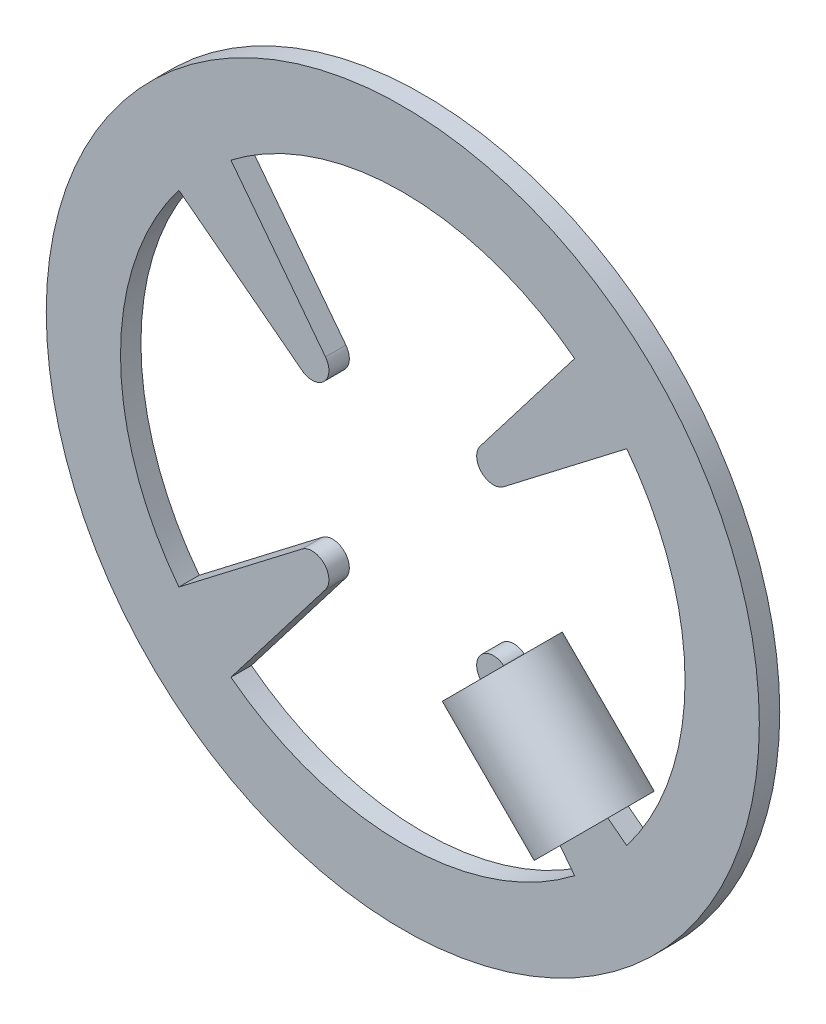
ISO-10303-21;
HEADER;
FILE_DESCRIPTION(('STEP AP214'),'2;1');
FILE_NAME('part.step','',(''),(''),'','','');
FILE_SCHEMA(('AUTOMOTIVE_DESIGN { 1 0 10303 214 1 1 1 1 }'));
ENDSEC;
DATA;
#1=APPLICATION_CONTEXT('core data for automotive mechanical design processes');
#2=APPLICATION_PROTOCOL_DEFINITION('international standard','automotive_design',2000,#1);
#3=PRODUCT_CONTEXT('',#1,'mechanical');
#4=PRODUCT('Part','Part','',(#3));
#5=PRODUCT_RELATED_PRODUCT_CATEGORY('part','',(#4));
#6=PRODUCT_DEFINITION_FORMATION('','',#4);
#7=PRODUCT_DEFINITION_CONTEXT('part definition',#1,'design');
#8=PRODUCT_DEFINITION('design','',#6,#7);
#9=PRODUCT_DEFINITION_SHAPE('','',#8);
#10=(LENGTH_UNIT() NAMED_UNIT(*) SI_UNIT(.MILLI.,.METRE.));
#11=(NAMED_UNIT(*) PLANE_ANGLE_UNIT() SI_UNIT($,.RADIAN.));
#12=(NAMED_UNIT(*) SI_UNIT($,.STERADIAN.) SOLID_ANGLE_UNIT());
#13=UNCERTAINTY_MEASURE_WITH_UNIT(LENGTH_MEASURE(1.E-05),#10,'distance_accuracy_value','');
#14=(GEOMETRIC_REPRESENTATION_CONTEXT(3) GLOBAL_UNCERTAINTY_ASSIGNED_CONTEXT((#13)) GLOBAL_UNIT_ASSIGNED_CONTEXT((#10,
#11,#12)) REPRESENTATION_CONTEXT('',''));
#15=CARTESIAN_POINT('',(0.,0.,0.));
#16=DIRECTION('',(0.,0.,1.));
#17=DIRECTION('',(1.,0.,0.));
#18=AXIS2_PLACEMENT_3D('',#15,#16,#17);
#19=CARTESIAN_POINT('',(0.487903679018716,-0.487903679018716,0.0275));
#20=DIRECTION('',(0.707106781186547,-0.707106781186548,0.));
#21=DIRECTION('',(0.707106781186548,0.707106781186547,0.));
#22=AXIS2_PLACEMENT_3D('',#19,#20,#21);
#23=PLANE('',#22);
#24=CARTESIAN_POINT('',(0.487903679018716,-0.487903679018716,0.0275));
#25=DIRECTION('',(0.707106781186547,-0.707106781186548,0.));
#26=DIRECTION('',(0.707106781186548,0.707106781186547,0.));
#27=AXIS2_PLACEMENT_3D('',#24,#25,#26);
#28=CIRCLE('',#27,0.132);
#29=CARTESIAN_POINT('',(0.58124177413534,-0.394565583902092,0.0275));
#30=VERTEX_POINT('',#29);
#31=EDGE_CURVE('E11',#30,#30,#28,.T.);
#32=ORIENTED_EDGE('',*,*,#31,.T.);
#33=EDGE_LOOP('',(#32));
#34=FACE_BOUND('',#33,.T.);
#35=CARTESIAN_POINT('',(0.487903679018716,-0.487903679018716,0.0275));
#36=DIRECTION('',(0.707106781186547,-0.707106781186548,0.));
#37=DIRECTION('',(0.707106781186548,0.707106781186547,0.));
#38=AXIS2_PLACEMENT_3D('',#35,#36,#37);
#39=CIRCLE('',#38,0.1);
#40=CARTESIAN_POINT('',(0.558614357137371,-0.417193000900062,0.0275));
#41=VERTEX_POINT('',#40);
#42=EDGE_CURVE('E60',#41,#41,#39,.T.);
#43=ORIENTED_EDGE('',*,*,#42,.F.);
#44=EDGE_LOOP('',(#43));
#45=FACE_BOUND('',#44,.T.);
#46=ADVANCED_FACE('F49',(#34,#45),#23,.T.);
#47=CARTESIAN_POINT('',(0.240416305603425,-0.240416305603425,0.0275));
#48=DIRECTION('',(0.707106781186547,-0.707106781186548,0.));
#49=DIRECTION('',(0.707106781186548,0.707106781186547,0.));
#50=AXIS2_PLACEMENT_3D('',#47,#48,#49);
#51=PLANE('',#50);
#52=CARTESIAN_POINT('',(0.240416305603425,-0.240416305603425,0.0275));
#53=DIRECTION('',(0.707106781186547,-0.707106781186548,0.));
#54=DIRECTION('',(0.707106781186548,0.707106781186547,0.));
#55=AXIS2_PLACEMENT_3D('',#52,#53,#54);
#56=CIRCLE('',#55,0.132);
#57=CARTESIAN_POINT('',(0.333754400720049,-0.1470782104868,0.0275));
#58=VERTEX_POINT('',#57);
#59=EDGE_CURVE('E53',#58,#58,#56,.T.);
#60=ORIENTED_EDGE('',*,*,#59,.F.);
#61=EDGE_LOOP('',(#60));
#62=FACE_BOUND('',#61,.T.);
#63=CARTESIAN_POINT('',(0.240416305603425,-0.240416305603425,0.0275));
#64=DIRECTION('',(0.707106781186547,-0.707106781186548,0.));
#65=DIRECTION('',(0.707106781186548,0.707106781186547,0.));
#66=AXIS2_PLACEMENT_3D('',#63,#64,#65);
#67=CIRCLE('',#66,0.1);
#68=CARTESIAN_POINT('',(0.311126983722079,-0.16970562748477,0.0275));
#69=VERTEX_POINT('',#68);
#70=EDGE_CURVE('E62',#69,#69,#67,.T.);
#71=ORIENTED_EDGE('',*,*,#70,.T.);
#72=EDGE_LOOP('',(#71));
#73=FACE_BOUND('',#72,.T.);
#74=ADVANCED_FACE('F72',(#62,#73),#51,.F.);
#75=CARTESIAN_POINT('',(0.487903679018716,-0.487903679018716,0.0275));
#76=DIRECTION('',(-0.707106781186547,0.707106781186548,0.));
#77=DIRECTION('',(-0.707106781186548,-0.707106781186547,0.));
#78=AXIS2_PLACEMENT_3D('',#75,#76,#77);
#79=CYLINDRICAL_SURFACE('',#78,0.132);
#80=ORIENTED_EDGE('',*,*,#31,.F.);
#81=EDGE_LOOP('',(#80));
#82=FACE_BOUND('',#81,.T.);
#83=ORIENTED_EDGE('',*,*,#59,.T.);
#84=EDGE_LOOP('',(#83));
#85=FACE_BOUND('',#84,.T.);
#86=ADVANCED_FACE('F51',(#82,#85),#79,.T.);
#87=CARTESIAN_POINT('',(0.487903679018716,-0.487903679018716,0.0275));
#88=DIRECTION('',(-0.707106781186547,0.707106781186548,0.));
#89=DIRECTION('',(-0.707106781186548,-0.707106781186547,0.));
#90=AXIS2_PLACEMENT_3D('',#87,#88,#89);
#91=CYLINDRICAL_SURFACE('',#90,0.1);
#92=ORIENTED_EDGE('',*,*,#42,.T.);
#93=EDGE_LOOP('',(#92));
#94=FACE_BOUND('',#93,.T.);
#95=ORIENTED_EDGE('',*,*,#70,.F.);
#96=EDGE_LOOP('',(#95));
#97=FACE_BOUND('',#96,.T.);
#98=ADVANCED_FACE('F68',(#94,#97),#91,.F.);
#99=CLOSED_SHELL('',(#46,#74,#86,#98));
#100=MANIFOLD_SOLID_BREP('B2',#99);
#101=CARTESIAN_POINT('',(0.,0.,0.055));
#102=DIRECTION('',(0.,0.,-1.));
#103=DIRECTION('',(-1.,0.,0.));
#104=AXIS2_PLACEMENT_3D('',#101,#102,#103);
#105=CYLINDRICAL_SURFACE('',#104,0.76);
#106=CARTESIAN_POINT('',(0.,0.,0.));
#107=DIRECTION('',(0.,0.,1.));
#108=DIRECTION('',(1.,0.,0.));
#109=AXIS2_PLACEMENT_3D('',#106,#107,#108);
#110=CIRCLE('',#109,0.76);
#111=CARTESIAN_POINT('',(-0.462658686046631,-0.602948538621336,0.));
#112=VERTEX_POINT('',#111);
#113=CARTESIAN_POINT('',(0.462658686046628,-0.602948538621339,0.));
#114=VERTEX_POINT('',#113);
#115=EDGE_CURVE('E352',#112,#114,#110,.T.);
#116=ORIENTED_EDGE('',*,*,#115,.F.);
#117=DIRECTION('',(0.,0.,1.));
#118=VECTOR('',#117,1.);
#119=CARTESIAN_POINT('',(-0.462658686046631,-0.602948538621336,0.));
#120=LINE('',#119,#118);
#121=CARTESIAN_POINT('',(-0.462658686046631,-0.602948538621336,0.055));
#122=VERTEX_POINT('',#121);
#123=EDGE_CURVE('E134',#112,#122,#120,.T.);
#124=ORIENTED_EDGE('',*,*,#123,.T.);
#125=CARTESIAN_POINT('',(0.,0.,0.055));
#126=DIRECTION('',(0.,0.,1.));
#127=DIRECTION('',(1.,0.,0.));
#128=AXIS2_PLACEMENT_3D('',#125,#126,#127);
#129=CIRCLE('',#128,0.76);
#130=CARTESIAN_POINT('',(0.462658686046628,-0.602948538621339,0.055));
#131=VERTEX_POINT('',#130);
#132=EDGE_CURVE('E350',#122,#131,#129,.T.);
#133=ORIENTED_EDGE('',*,*,#132,.T.);
#134=DIRECTION('',(0.,0.,1.));
#135=VECTOR('',#134,1.);
#136=CARTESIAN_POINT('',(0.462658686046628,-0.602948538621339,0.));
#137=LINE('',#136,#135);
#138=EDGE_CURVE('E287',#114,#131,#137,.T.);
#139=ORIENTED_EDGE('',*,*,#138,.F.);
#140=EDGE_LOOP('',(#116,#124,#133,#139));
#141=FACE_BOUND('',#140,.T.);
#142=ADVANCED_FACE('F119',(#141),#105,.F.);
#143=CARTESIAN_POINT('',(0.602948538621336,-0.462658686046631,0.));
#144=VERTEX_POINT('',#143);
#145=CARTESIAN_POINT('',(0.602948538621339,0.462658686046628,0.));
#146=VERTEX_POINT('',#145);
#147=EDGE_CURVE('E354',#144,#146,#110,.T.);
#148=ORIENTED_EDGE('',*,*,#147,.F.);
#149=DIRECTION('',(0.,0.,1.));
#150=VECTOR('',#149,1.);
#151=CARTESIAN_POINT('',(0.602948538621336,-0.462658686046631,0.));
#152=LINE('',#151,#150);
#153=CARTESIAN_POINT('',(0.602948538621336,-0.462658686046631,0.055));
#154=VERTEX_POINT('',#153);
#155=EDGE_CURVE('E142',#144,#154,#152,.T.);
#156=ORIENTED_EDGE('',*,*,#155,.T.);
#157=CARTESIAN_POINT('',(0.602948538621339,0.462658686046628,0.055));
#158=VERTEX_POINT('',#157);
#159=EDGE_CURVE('E353',#154,#158,#129,.T.);
#160=ORIENTED_EDGE('',*,*,#159,.T.);
#161=DIRECTION('',(0.,0.,1.));
#162=VECTOR('',#161,1.);
#163=CARTESIAN_POINT('',(0.602948538621339,0.462658686046628,0.));
#164=LINE('',#163,#162);
#165=EDGE_CURVE('E314',#146,#158,#164,.T.);
#166=ORIENTED_EDGE('',*,*,#165,.F.);
#167=EDGE_LOOP('',(#148,#156,#160,#166));
#168=FACE_BOUND('',#167,.T.);
#169=ADVANCED_FACE('F367',(#168),#105,.F.);
#170=CARTESIAN_POINT('',(0.462658686046631,0.602948538621336,0.));
#171=VERTEX_POINT('',#170);
#172=CARTESIAN_POINT('',(-0.462658686046628,0.602948538621339,0.));
#173=VERTEX_POINT('',#172);
#174=EDGE_CURVE('E340',#171,#173,#110,.T.);
#175=ORIENTED_EDGE('',*,*,#174,.F.);
#176=DIRECTION('',(0.,0.,1.));
#177=VECTOR('',#176,1.);
#178=CARTESIAN_POINT('',(0.462658686046631,0.602948538621336,0.));
#179=LINE('',#178,#177);
#180=CARTESIAN_POINT('',(0.462658686046631,0.602948538621336,0.055));
#181=VERTEX_POINT('',#180);
#182=EDGE_CURVE('E310',#171,#181,#179,.T.);
#183=ORIENTED_EDGE('',*,*,#182,.T.);
#184=CARTESIAN_POINT('',(-0.462658686046628,0.602948538621339,0.055));
#185=VERTEX_POINT('',#184);
#186=EDGE_CURVE('E351',#181,#185,#129,.T.);
#187=ORIENTED_EDGE('',*,*,#186,.T.);
#188=DIRECTION('',(0.,0.,1.));
#189=VECTOR('',#188,1.);
#190=CARTESIAN_POINT('',(-0.462658686046628,0.602948538621339,0.));
#191=LINE('',#190,#189);
#192=EDGE_CURVE('E341',#173,#185,#191,.T.);
#193=ORIENTED_EDGE('',*,*,#192,.F.);
#194=EDGE_LOOP('',(#175,#183,#187,#193));
#195=FACE_BOUND('',#194,.T.);
#196=ADVANCED_FACE('F403',(#195),#105,.F.);
#197=DIRECTION('',(0.,0.,1.));
#198=VECTOR('',#197,1.);
#199=CARTESIAN_POINT('',(-0.602948538621339,-0.462658686046628,0.));
#200=LINE('',#199,#198);
#201=CARTESIAN_POINT('',(-0.602948538621339,-0.462658686046628,0.));
#202=VERTEX_POINT('',#201);
#203=CARTESIAN_POINT('',(-0.602948538621339,-0.462658686046628,0.055));
#204=VERTEX_POINT('',#203);
#205=EDGE_CURVE('E244',#202,#204,#200,.T.);
#206=ORIENTED_EDGE('',*,*,#205,.F.);
#207=CARTESIAN_POINT('',(-0.602948538621336,0.462658686046631,0.));
#208=VERTEX_POINT('',#207);
#209=EDGE_CURVE('E253',#208,#202,#110,.T.);
#210=ORIENTED_EDGE('',*,*,#209,.F.);
#211=DIRECTION('',(0.,0.,1.));
#212=VECTOR('',#211,1.);
#213=CARTESIAN_POINT('',(-0.602948538621336,0.462658686046631,0.));
#214=LINE('',#213,#212);
#215=CARTESIAN_POINT('',(-0.602948538621336,0.462658686046631,0.055));
#216=VERTEX_POINT('',#215);
#217=EDGE_CURVE('E337',#208,#216,#214,.T.);
#218=ORIENTED_EDGE('',*,*,#217,.T.);
#219=EDGE_CURVE('E347',#216,#204,#129,.T.);
#220=ORIENTED_EDGE('',*,*,#219,.T.);
#221=EDGE_LOOP('',(#206,#210,#218,#220));
#222=FACE_BOUND('',#221,.T.);
#223=ADVANCED_FACE('F387',(#222),#105,.F.);
#224=CARTESIAN_POINT('',(0.,0.,0.055));
#225=DIRECTION('',(0.,0.,1.));
#226=DIRECTION('',(1.,0.,0.));
#227=AXIS2_PLACEMENT_3D('',#224,#225,#226);
#228=PLANE('',#227);
#229=CARTESIAN_POINT('',(0.,0.,0.055));
#230=DIRECTION('',(0.,0.,1.));
#231=DIRECTION('',(1.,0.,0.));
#232=AXIS2_PLACEMENT_3D('',#229,#230,#231);
#233=CIRCLE('',#232,0.96);
#234=CARTESIAN_POINT('',(0.96,0.,0.055));
#235=VERTEX_POINT('',#234);
#236=EDGE_CURVE('E47',#235,#235,#233,.T.);
#237=ORIENTED_EDGE('',*,*,#236,.T.);
#238=EDGE_LOOP('',(#237));
#239=FACE_BOUND('',#238,.T.);
#240=ORIENTED_EDGE('',*,*,#219,.F.);
#241=DIRECTION('',(-0.793353340291235,0.60876142900872,0.));
#242=VECTOR('',#241,1.);
#243=CARTESIAN_POINT('',(0.,0.,0.055));
#244=LINE('',#243,#242);
#245=CARTESIAN_POINT('',(-0.271393831112811,0.208247810983869,0.055));
#246=VERTEX_POINT('',#245);
#247=EDGE_CURVE('E313',#246,#216,#244,.T.);
#248=ORIENTED_EDGE('',*,*,#247,.F.);
#249=CARTESIAN_POINT('',(-0.243977486679677,0.243977486679683,0.055));
#250=DIRECTION('',(0.,0.,1.));
#251=DIRECTION('',(1.,0.,0.));
#252=AXIS2_PLACEMENT_3D('',#249,#250,#251);
#253=CIRCLE('',#252,0.0450362705761065);
#254=CARTESIAN_POINT('',(-0.208247810983862,0.271393831112816,0.055));
#255=VERTEX_POINT('',#254);
#256=EDGE_CURVE('E332',#246,#255,#253,.T.);
#257=ORIENTED_EDGE('',*,*,#256,.T.);
#258=DIRECTION('',(-0.608761429008729,0.793353340291229,0.));
#259=VECTOR('',#258,1.);
#260=CARTESIAN_POINT('',(0.,0.,0.055));
#261=LINE('',#260,#259);
#262=EDGE_CURVE('E323',#255,#185,#261,.T.);
#263=ORIENTED_EDGE('',*,*,#262,.T.);
#264=ORIENTED_EDGE('',*,*,#186,.F.);
#265=DIRECTION('',(0.608761429008728,0.79335334029123,0.));
#266=VECTOR('',#265,1.);
#267=CARTESIAN_POINT('',(0.,0.,0.055));
#268=LINE('',#267,#266);
#269=CARTESIAN_POINT('',(0.208247810983866,0.271393831112813,0.055));
#270=VERTEX_POINT('',#269);
#271=EDGE_CURVE('E286',#270,#181,#268,.T.);
#272=ORIENTED_EDGE('',*,*,#271,.F.);
#273=CARTESIAN_POINT('',(0.24397748667968,0.243977486679679,0.055));
#274=DIRECTION('',(0.,0.,1.));
#275=DIRECTION('',(1.,0.,0.));
#276=AXIS2_PLACEMENT_3D('',#273,#274,#275);
#277=CIRCLE('',#276,0.0450362705761065);
#278=CARTESIAN_POINT('',(0.271393831112814,0.208247810983865,0.055));
#279=VERTEX_POINT('',#278);
#280=EDGE_CURVE('E305',#270,#279,#277,.T.);
#281=ORIENTED_EDGE('',*,*,#280,.T.);
#282=DIRECTION('',(0.793353340291234,0.608761429008722,0.));
#283=VECTOR('',#282,1.);
#284=CARTESIAN_POINT('',(0.,0.,0.055));
#285=LINE('',#284,#283);
#286=EDGE_CURVE('E297',#279,#158,#285,.T.);
#287=ORIENTED_EDGE('',*,*,#286,.T.);
#288=ORIENTED_EDGE('',*,*,#159,.F.);
#289=DIRECTION('',(0.793353340291232,-0.608761429008725,0.));
#290=VECTOR('',#289,1.);
#291=CARTESIAN_POINT('',(0.,0.,0.055));
#292=LINE('',#291,#290);
#293=CARTESIAN_POINT('',(0.271393831112813,-0.208247810983867,0.055));
#294=VERTEX_POINT('',#293);
#295=EDGE_CURVE('E266',#294,#154,#292,.T.);
#296=ORIENTED_EDGE('',*,*,#295,.F.);
#297=CARTESIAN_POINT('',(0.243977486679678,-0.243977486679681,0.055));
#298=DIRECTION('',(0.,0.,1.));
#299=DIRECTION('',(1.,0.,0.));
#300=AXIS2_PLACEMENT_3D('',#297,#298,#299);
#301=CIRCLE('',#300,0.0450362705761065);
#302=CARTESIAN_POINT('',(0.208247810983864,-0.271393831112815,0.055));
#303=VERTEX_POINT('',#302);
#304=EDGE_CURVE('E280',#294,#303,#301,.T.);
#305=ORIENTED_EDGE('',*,*,#304,.T.);
#306=DIRECTION('',(0.608761429008724,-0.793353340291233,0.));
#307=VECTOR('',#306,1.);
#308=CARTESIAN_POINT('',(0.,0.,0.055));
#309=LINE('',#308,#307);
#310=EDGE_CURVE('E272',#303,#131,#309,.T.);
#311=ORIENTED_EDGE('',*,*,#310,.T.);
#312=ORIENTED_EDGE('',*,*,#132,.F.);
#313=DIRECTION('',(-0.608761429008723,-0.793353340291233,0.));
#314=VECTOR('',#313,1.);
#315=CARTESIAN_POINT('',(0.,0.,0.055));
#316=LINE('',#315,#314);
#317=CARTESIAN_POINT('',(-0.208247810983868,-0.271393831112812,0.055));
#318=VERTEX_POINT('',#317);
#319=EDGE_CURVE('E257',#318,#122,#316,.T.);
#320=ORIENTED_EDGE('',*,*,#319,.F.);
#321=CARTESIAN_POINT('',(-0.243977486679682,-0.243977486679678,0.055));
#322=DIRECTION('',(0.,0.,1.));
#323=DIRECTION('',(1.,0.,0.));
#324=AXIS2_PLACEMENT_3D('',#321,#322,#323);
#325=CIRCLE('',#324,0.0450362705761065);
#326=CARTESIAN_POINT('',(-0.271393831112815,-0.208247810983863,0.055));
#327=VERTEX_POINT('',#326);
#328=EDGE_CURVE('E262',#318,#327,#325,.T.);
#329=ORIENTED_EDGE('',*,*,#328,.T.);
#330=DIRECTION('',(-0.793353340291231,-0.608761429008727,0.));
#331=VECTOR('',#330,1.);
#332=CARTESIAN_POINT('',(0.,0.,0.055));
#333=LINE('',#332,#331);
#334=EDGE_CURVE('E239',#327,#204,#333,.T.);
#335=ORIENTED_EDGE('',*,*,#334,.T.);
#336=EDGE_LOOP('',(#240,#248,#257,#263,#264,#272,#281,#287,#288,#296,#305,#311,#312,#320,#329,#335));
#337=FACE_BOUND('',#336,.T.);
#338=ADVANCED_FACE('F380',(#239,#337),#228,.T.);
#339=CARTESIAN_POINT('',(0.,0.,0.));
#340=DIRECTION('',(0.,0.,1.));
#341=DIRECTION('',(1.,0.,0.));
#342=AXIS2_PLACEMENT_3D('',#339,#340,#341);
#343=PLANE('',#342);
#344=CARTESIAN_POINT('',(0.,0.,0.));
#345=DIRECTION('',(0.,0.,1.));
#346=DIRECTION('',(1.,0.,0.));
#347=AXIS2_PLACEMENT_3D('',#344,#345,#346);
#348=CIRCLE('',#347,0.96);
#349=CARTESIAN_POINT('',(0.96,0.,0.));
#350=VERTEX_POINT('',#349);
#351=EDGE_CURVE('E123',#350,#350,#348,.T.);
#352=ORIENTED_EDGE('',*,*,#351,.F.);
#353=EDGE_LOOP('',(#352));
#354=FACE_BOUND('',#353,.T.);
#355=ORIENTED_EDGE('',*,*,#209,.T.);
#356=DIRECTION('',(-0.793353340291231,-0.608761429008727,0.));
#357=VECTOR('',#356,1.);
#358=CARTESIAN_POINT('',(0.,0.,0.));
#359=LINE('',#358,#357);
#360=CARTESIAN_POINT('',(-0.271393831112815,-0.208247810983863,0.));
#361=VERTEX_POINT('',#360);
#362=EDGE_CURVE('E236',#361,#202,#359,.T.);
#363=ORIENTED_EDGE('',*,*,#362,.F.);
#364=CARTESIAN_POINT('',(-0.243977486679682,-0.243977486679678,0.));
#365=DIRECTION('',(0.,0.,1.));
#366=DIRECTION('',(1.,0.,0.));
#367=AXIS2_PLACEMENT_3D('',#364,#365,#366);
#368=CIRCLE('',#367,0.0450362705761065);
#369=CARTESIAN_POINT('',(-0.208247810983868,-0.271393831112812,0.));
#370=VERTEX_POINT('',#369);
#371=EDGE_CURVE('E251',#370,#361,#368,.T.);
#372=ORIENTED_EDGE('',*,*,#371,.F.);
#373=DIRECTION('',(-0.608761429008723,-0.793353340291233,0.));
#374=VECTOR('',#373,1.);
#375=CARTESIAN_POINT('',(0.,0.,0.));
#376=LINE('',#375,#374);
#377=EDGE_CURVE('E245',#370,#112,#376,.T.);
#378=ORIENTED_EDGE('',*,*,#377,.T.);
#379=ORIENTED_EDGE('',*,*,#115,.T.);
#380=DIRECTION('',(0.608761429008724,-0.793353340291233,0.));
#381=VECTOR('',#380,1.);
#382=CARTESIAN_POINT('',(0.,0.,0.));
#383=LINE('',#382,#381);
#384=CARTESIAN_POINT('',(0.208247810983864,-0.271393831112815,0.));
#385=VERTEX_POINT('',#384);
#386=EDGE_CURVE('E275',#385,#114,#383,.T.);
#387=ORIENTED_EDGE('',*,*,#386,.F.);
#388=CARTESIAN_POINT('',(0.243977486679678,-0.243977486679681,0.));
#389=DIRECTION('',(0.,0.,1.));
#390=DIRECTION('',(1.,0.,0.));
#391=AXIS2_PLACEMENT_3D('',#388,#389,#390);
#392=CIRCLE('',#391,0.0450362705761065);
#393=CARTESIAN_POINT('',(0.271393831112813,-0.208247810983867,0.));
#394=VERTEX_POINT('',#393);
#395=EDGE_CURVE('E271',#394,#385,#392,.T.);
#396=ORIENTED_EDGE('',*,*,#395,.F.);
#397=DIRECTION('',(0.793353340291232,-0.608761429008725,0.));
#398=VECTOR('',#397,1.);
#399=CARTESIAN_POINT('',(0.,0.,0.));
#400=LINE('',#399,#398);
#401=EDGE_CURVE('E269',#394,#144,#400,.T.);
#402=ORIENTED_EDGE('',*,*,#401,.T.);
#403=ORIENTED_EDGE('',*,*,#147,.T.);
#404=DIRECTION('',(0.793353340291234,0.608761429008722,0.));
#405=VECTOR('',#404,1.);
#406=CARTESIAN_POINT('',(0.,0.,0.));
#407=LINE('',#406,#405);
#408=CARTESIAN_POINT('',(0.271393831112814,0.208247810983865,0.));
#409=VERTEX_POINT('',#408);
#410=EDGE_CURVE('E300',#409,#146,#407,.T.);
#411=ORIENTED_EDGE('',*,*,#410,.F.);
#412=CARTESIAN_POINT('',(0.24397748667968,0.243977486679679,0.));
#413=DIRECTION('',(0.,0.,1.));
#414=DIRECTION('',(1.,0.,0.));
#415=AXIS2_PLACEMENT_3D('',#412,#413,#414);
#416=CIRCLE('',#415,0.0450362705761065);
#417=CARTESIAN_POINT('',(0.208247810983866,0.271393831112813,0.));
#418=VERTEX_POINT('',#417);
#419=EDGE_CURVE('E296',#418,#409,#416,.T.);
#420=ORIENTED_EDGE('',*,*,#419,.F.);
#421=DIRECTION('',(0.608761429008728,0.79335334029123,0.));
#422=VECTOR('',#421,1.);
#423=CARTESIAN_POINT('',(0.,0.,0.));
#424=LINE('',#423,#422);
#425=EDGE_CURVE('E293',#418,#171,#424,.T.);
#426=ORIENTED_EDGE('',*,*,#425,.T.);
#427=ORIENTED_EDGE('',*,*,#174,.T.);
#428=DIRECTION('',(-0.608761429008729,0.793353340291229,0.));
#429=VECTOR('',#428,1.);
#430=CARTESIAN_POINT('',(0.,0.,0.));
#431=LINE('',#430,#429);
#432=CARTESIAN_POINT('',(-0.208247810983862,0.271393831112816,0.));
#433=VERTEX_POINT('',#432);
#434=EDGE_CURVE('E326',#433,#173,#431,.T.);
#435=ORIENTED_EDGE('',*,*,#434,.F.);
#436=CARTESIAN_POINT('',(-0.243977486679677,0.243977486679683,0.));
#437=DIRECTION('',(0.,0.,1.));
#438=DIRECTION('',(1.,0.,0.));
#439=AXIS2_PLACEMENT_3D('',#436,#437,#438);
#440=CIRCLE('',#439,0.0450362705761065);
#441=CARTESIAN_POINT('',(-0.271393831112811,0.208247810983869,0.));
#442=VERTEX_POINT('',#441);
#443=EDGE_CURVE('E322',#442,#433,#440,.T.);
#444=ORIENTED_EDGE('',*,*,#443,.F.);
#445=DIRECTION('',(-0.793353340291235,0.60876142900872,0.));
#446=VECTOR('',#445,1.);
#447=CARTESIAN_POINT('',(0.,0.,0.));
#448=LINE('',#447,#446);
#449=EDGE_CURVE('E320',#442,#208,#448,.T.);
#450=ORIENTED_EDGE('',*,*,#449,.T.);
#451=EDGE_LOOP('',(#355,#363,#372,#378,#379,#387,#396,#402,#403,#411,#420,#426,#427,#435,#444,#450));
#452=FACE_BOUND('',#451,.T.);
#453=ADVANCED_FACE('F250',(#354,#452),#343,.F.);
#454=CARTESIAN_POINT('',(0.,0.,0.055));
#455=DIRECTION('',(0.,0.,-1.));
#456=DIRECTION('',(-1.,0.,0.));
#457=AXIS2_PLACEMENT_3D('',#454,#455,#456);
#458=CYLINDRICAL_SURFACE('',#457,0.96);
#459=ORIENTED_EDGE('',*,*,#236,.F.);
#460=EDGE_LOOP('',(#459));
#461=FACE_BOUND('',#460,.T.);
#462=ORIENTED_EDGE('',*,*,#351,.T.);
#463=EDGE_LOOP('',(#462));
#464=FACE_BOUND('',#463,.T.);
#465=ADVANCED_FACE('F121',(#461,#464),#458,.T.);
#466=CARTESIAN_POINT('',(0.,0.,0.));
#467=DIRECTION('',(0.60876142900872,0.793353340291235,0.));
#468=DIRECTION('',(-0.793353340291235,0.60876142900872,0.));
#469=AXIS2_PLACEMENT_3D('',#466,#467,#468);
#470=PLANE('',#469);
#471=ORIENTED_EDGE('',*,*,#247,.T.);
#472=ORIENTED_EDGE('',*,*,#217,.F.);
#473=ORIENTED_EDGE('',*,*,#449,.F.);
#474=DIRECTION('',(0.,0.,1.));
#475=VECTOR('',#474,1.);
#476=CARTESIAN_POINT('',(-0.271393831112811,0.208247810983869,0.));
#477=LINE('',#476,#475);
#478=EDGE_CURVE('E329',#442,#246,#477,.T.);
#479=ORIENTED_EDGE('',*,*,#478,.T.);
#480=EDGE_LOOP('',(#471,#472,#473,#479));
#481=FACE_BOUND('',#480,.T.);
#482=ADVANCED_FACE('F391',(#481),#470,.F.);
#483=CARTESIAN_POINT('',(0.,0.,0.));
#484=DIRECTION('',(0.793353340291229,0.608761429008729,0.));
#485=DIRECTION('',(-0.608761429008729,0.793353340291229,0.));
#486=AXIS2_PLACEMENT_3D('',#483,#484,#485);
#487=PLANE('',#486);
#488=ORIENTED_EDGE('',*,*,#262,.F.);
#489=DIRECTION('',(0.,0.,1.));
#490=VECTOR('',#489,1.);
#491=CARTESIAN_POINT('',(-0.208247810983862,0.271393831112816,0.));
#492=LINE('',#491,#490);
#493=EDGE_CURVE('E344',#433,#255,#492,.T.);
#494=ORIENTED_EDGE('',*,*,#493,.F.);
#495=ORIENTED_EDGE('',*,*,#434,.T.);
#496=ORIENTED_EDGE('',*,*,#192,.T.);
#497=EDGE_LOOP('',(#488,#494,#495,#496));
#498=FACE_BOUND('',#497,.T.);
#499=ADVANCED_FACE('F398',(#498),#487,.T.);
#500=CARTESIAN_POINT('',(-0.243977486679677,0.243977486679683,0.));
#501=DIRECTION('',(0.,0.,1.));
#502=DIRECTION('',(1.,0.,0.));
#503=AXIS2_PLACEMENT_3D('',#500,#501,#502);
#504=CYLINDRICAL_SURFACE('',#503,0.0450362705761065);
#505=ORIENTED_EDGE('',*,*,#256,.F.);
#506=ORIENTED_EDGE('',*,*,#478,.F.);
#507=ORIENTED_EDGE('',*,*,#443,.T.);
#508=ORIENTED_EDGE('',*,*,#493,.T.);
#509=EDGE_LOOP('',(#505,#506,#507,#508));
#510=FACE_BOUND('',#509,.T.);
#511=ADVANCED_FACE('F394',(#510),#504,.T.);
#512=CARTESIAN_POINT('',(0.,0.,0.));
#513=DIRECTION('',(0.79335334029123,-0.608761429008728,0.));
#514=DIRECTION('',(0.608761429008728,0.79335334029123,0.));
#515=AXIS2_PLACEMENT_3D('',#512,#513,#514);
#516=PLANE('',#515);
#517=ORIENTED_EDGE('',*,*,#271,.T.);
#518=ORIENTED_EDGE('',*,*,#182,.F.);
#519=ORIENTED_EDGE('',*,*,#425,.F.);
#520=DIRECTION('',(0.,0.,1.));
#521=VECTOR('',#520,1.);
#522=CARTESIAN_POINT('',(0.208247810983866,0.271393831112813,0.));
#523=LINE('',#522,#521);
#524=EDGE_CURVE('E303',#418,#270,#523,.T.);
#525=ORIENTED_EDGE('',*,*,#524,.T.);
#526=EDGE_LOOP('',(#517,#518,#519,#525));
#527=FACE_BOUND('',#526,.T.);
#528=ADVANCED_FACE('F406',(#527),#516,.F.);
#529=CARTESIAN_POINT('',(0.,0.,0.));
#530=DIRECTION('',(0.608761429008722,-0.793353340291234,0.));
#531=DIRECTION('',(0.793353340291234,0.608761429008722,0.));
#532=AXIS2_PLACEMENT_3D('',#529,#530,#531);
#533=PLANE('',#532);
#534=ORIENTED_EDGE('',*,*,#286,.F.);
#535=DIRECTION('',(0.,0.,1.));
#536=VECTOR('',#535,1.);
#537=CARTESIAN_POINT('',(0.271393831112814,0.208247810983865,0.));
#538=LINE('',#537,#536);
#539=EDGE_CURVE('E317',#409,#279,#538,.T.);
#540=ORIENTED_EDGE('',*,*,#539,.F.);
#541=ORIENTED_EDGE('',*,*,#410,.T.);
#542=ORIENTED_EDGE('',*,*,#165,.T.);
#543=EDGE_LOOP('',(#534,#540,#541,#542));
#544=FACE_BOUND('',#543,.T.);
#545=ADVANCED_FACE('F366',(#544),#533,.T.);
#546=CARTESIAN_POINT('',(0.24397748667968,0.243977486679679,0.));
#547=DIRECTION('',(0.,0.,1.));
#548=DIRECTION('',(1.,0.,0.));
#549=AXIS2_PLACEMENT_3D('',#546,#547,#548);
#550=CYLINDRICAL_SURFACE('',#549,0.0450362705761065);
#551=ORIENTED_EDGE('',*,*,#280,.F.);
#552=ORIENTED_EDGE('',*,*,#524,.F.);
#553=ORIENTED_EDGE('',*,*,#419,.T.);
#554=ORIENTED_EDGE('',*,*,#539,.T.);
#555=EDGE_LOOP('',(#551,#552,#553,#554));
#556=FACE_BOUND('',#555,.T.);
#557=ADVANCED_FACE('F408',(#556),#550,.T.);
#558=CARTESIAN_POINT('',(0.,0.,0.));
#559=DIRECTION('',(-0.608761429008725,-0.793353340291232,0.));
#560=DIRECTION('',(0.793353340291232,-0.608761429008725,0.));
#561=AXIS2_PLACEMENT_3D('',#558,#559,#560);
#562=PLANE('',#561);
#563=ORIENTED_EDGE('',*,*,#295,.T.);
#564=ORIENTED_EDGE('',*,*,#155,.F.);
#565=ORIENTED_EDGE('',*,*,#401,.F.);
#566=DIRECTION('',(0.,0.,1.));
#567=VECTOR('',#566,1.);
#568=CARTESIAN_POINT('',(0.271393831112813,-0.208247810983867,0.));
#569=LINE('',#568,#567);
#570=EDGE_CURVE('E278',#394,#294,#569,.T.);
#571=ORIENTED_EDGE('',*,*,#570,.T.);
#572=EDGE_LOOP('',(#563,#564,#565,#571));
#573=FACE_BOUND('',#572,.T.);
#574=ADVANCED_FACE('F410',(#573),#562,.F.);
#575=CARTESIAN_POINT('',(0.,0.,0.));
#576=DIRECTION('',(-0.793353340291233,-0.608761429008724,0.));
#577=DIRECTION('',(0.608761429008724,-0.793353340291233,0.));
#578=AXIS2_PLACEMENT_3D('',#575,#576,#577);
#579=PLANE('',#578);
#580=ORIENTED_EDGE('',*,*,#310,.F.);
#581=DIRECTION('',(0.,0.,1.));
#582=VECTOR('',#581,1.);
#583=CARTESIAN_POINT('',(0.208247810983864,-0.271393831112815,0.));
#584=LINE('',#583,#582);
#585=EDGE_CURVE('E290',#385,#303,#584,.T.);
#586=ORIENTED_EDGE('',*,*,#585,.F.);
#587=ORIENTED_EDGE('',*,*,#386,.T.);
#588=ORIENTED_EDGE('',*,*,#138,.T.);
#589=EDGE_LOOP('',(#580,#586,#587,#588));
#590=FACE_BOUND('',#589,.T.);
#591=ADVANCED_FACE('F378',(#590),#579,.T.);
#592=CARTESIAN_POINT('',(0.243977486679678,-0.243977486679681,0.));
#593=DIRECTION('',(0.,0.,1.));
#594=DIRECTION('',(1.,0.,0.));
#595=AXIS2_PLACEMENT_3D('',#592,#593,#594);
#596=CYLINDRICAL_SURFACE('',#595,0.0450362705761065);
#597=ORIENTED_EDGE('',*,*,#304,.F.);
#598=ORIENTED_EDGE('',*,*,#570,.F.);
#599=ORIENTED_EDGE('',*,*,#395,.T.);
#600=ORIENTED_EDGE('',*,*,#585,.T.);
#601=EDGE_LOOP('',(#597,#598,#599,#600));
#602=FACE_BOUND('',#601,.T.);
#603=ADVANCED_FACE('F383',(#602),#596,.T.);
#604=CARTESIAN_POINT('',(-0.243977486679682,-0.243977486679678,0.));
#605=DIRECTION('',(0.,0.,1.));
#606=DIRECTION('',(1.,0.,0.));
#607=AXIS2_PLACEMENT_3D('',#604,#605,#606);
#608=CYLINDRICAL_SURFACE('',#607,0.0450362705761065);
#609=ORIENTED_EDGE('',*,*,#328,.F.);
#610=DIRECTION('',(0.,0.,1.));
#611=VECTOR('',#610,1.);
#612=CARTESIAN_POINT('',(-0.208247810983868,-0.271393831112812,0.));
#613=LINE('',#612,#611);
#614=EDGE_CURVE('E256',#370,#318,#613,.T.);
#615=ORIENTED_EDGE('',*,*,#614,.F.);
#616=ORIENTED_EDGE('',*,*,#371,.T.);
#617=DIRECTION('',(0.,0.,1.));
#618=VECTOR('',#617,1.);
#619=CARTESIAN_POINT('',(-0.271393831112815,-0.208247810983863,0.));
#620=LINE('',#619,#618);
#621=EDGE_CURVE('E233',#361,#327,#620,.T.);
#622=ORIENTED_EDGE('',*,*,#621,.T.);
#623=EDGE_LOOP('',(#609,#615,#616,#622));
#624=FACE_BOUND('',#623,.T.);
#625=ADVANCED_FACE('F255',(#624),#608,.T.);
#626=CARTESIAN_POINT('',(0.,0.,0.));
#627=DIRECTION('',(-0.793353340291233,0.608761429008723,0.));
#628=DIRECTION('',(-0.608761429008723,-0.793353340291233,0.));
#629=AXIS2_PLACEMENT_3D('',#626,#627,#628);
#630=PLANE('',#629);
#631=ORIENTED_EDGE('',*,*,#319,.T.);
#632=ORIENTED_EDGE('',*,*,#123,.F.);
#633=ORIENTED_EDGE('',*,*,#377,.F.);
#634=ORIENTED_EDGE('',*,*,#614,.T.);
#635=EDGE_LOOP('',(#631,#632,#633,#634));
#636=FACE_BOUND('',#635,.T.);
#637=ADVANCED_FACE('F384',(#636),#630,.F.);
#638=CARTESIAN_POINT('',(0.,0.,0.));
#639=DIRECTION('',(-0.608761429008727,0.793353340291231,0.));
#640=DIRECTION('',(-0.793353340291231,-0.608761429008727,0.));
#641=AXIS2_PLACEMENT_3D('',#638,#639,#640);
#642=PLANE('',#641);
#643=ORIENTED_EDGE('',*,*,#334,.F.);
#644=ORIENTED_EDGE('',*,*,#621,.F.);
#645=ORIENTED_EDGE('',*,*,#362,.T.);
#646=ORIENTED_EDGE('',*,*,#205,.T.);
#647=EDGE_LOOP('',(#643,#644,#645,#646));
#648=FACE_BOUND('',#647,.T.);
#649=ADVANCED_FACE('F235',(#648),#642,.T.);
#650=CLOSED_SHELL('',(#142,#169,#196,#223,#338,#453,#465,#482,#499,#511,#528,#545,#557,#574,
#591,#603,#625,#637,#649));
#651=MANIFOLD_SOLID_BREP('B6',#650);
#652=ADVANCED_BREP_SHAPE_REPRESENTATION('',(#18,#100,#651),#14);
#653=SHAPE_DEFINITION_REPRESENTATION(#9,#652);
ENDSEC;
END-ISO-10303-21;
